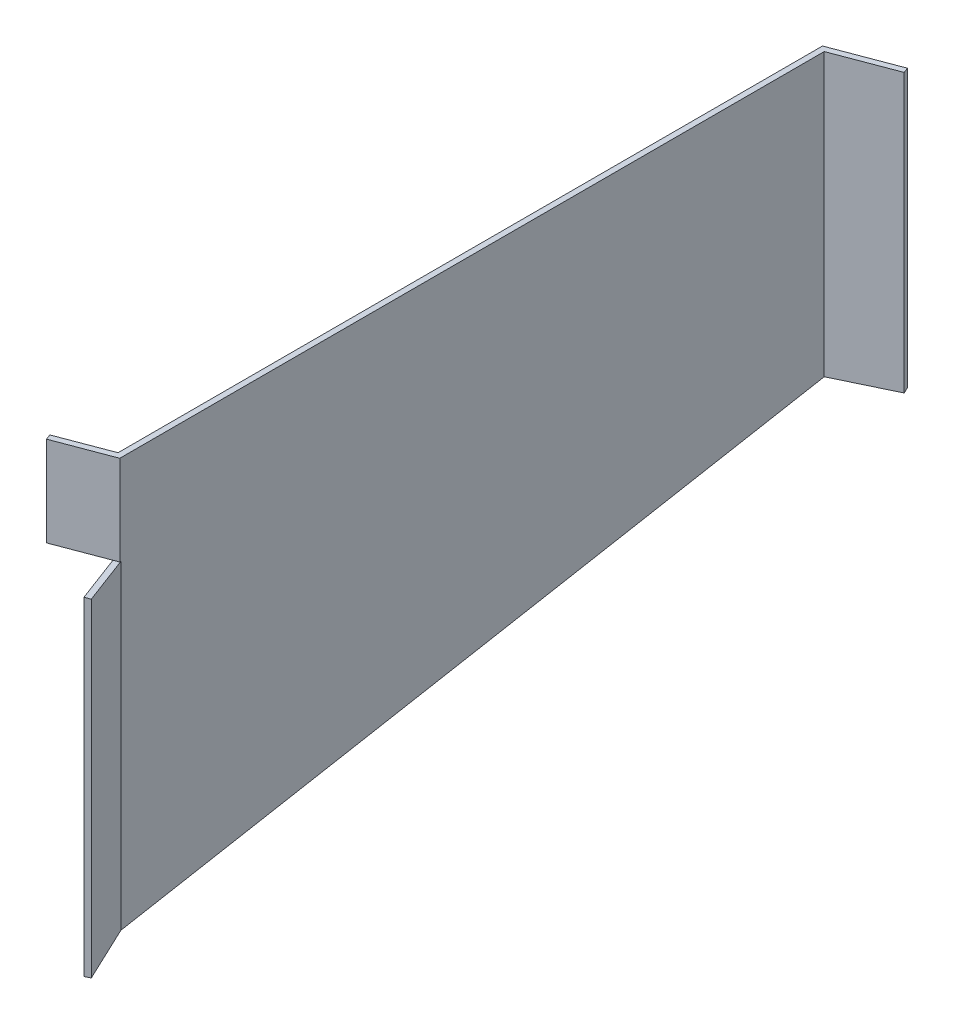
ISO-10303-21;
HEADER;
FILE_DESCRIPTION(('STEP AP214'),'2;1');
FILE_NAME('part.step','',(''),(''),'','','');
FILE_SCHEMA(('AUTOMOTIVE_DESIGN { 1 0 10303 214 1 1 1 1 }'));
ENDSEC;
DATA;
#1=APPLICATION_CONTEXT('core data for automotive mechanical design processes');
#2=APPLICATION_PROTOCOL_DEFINITION('international standard','automotive_design',2000,#1);
#3=PRODUCT_CONTEXT('',#1,'mechanical');
#4=PRODUCT('Part','Part','',(#3));
#5=PRODUCT_RELATED_PRODUCT_CATEGORY('part','',(#4));
#6=PRODUCT_DEFINITION_FORMATION('','',#4);
#7=PRODUCT_DEFINITION_CONTEXT('part definition',#1,'design');
#8=PRODUCT_DEFINITION('design','',#6,#7);
#9=PRODUCT_DEFINITION_SHAPE('','',#8);
#10=(LENGTH_UNIT() NAMED_UNIT(*) SI_UNIT(.MILLI.,.METRE.));
#11=(NAMED_UNIT(*) PLANE_ANGLE_UNIT() SI_UNIT($,.RADIAN.));
#12=(NAMED_UNIT(*) SI_UNIT($,.STERADIAN.) SOLID_ANGLE_UNIT());
#13=UNCERTAINTY_MEASURE_WITH_UNIT(LENGTH_MEASURE(1.E-05),#10,'distance_accuracy_value','');
#14=(GEOMETRIC_REPRESENTATION_CONTEXT(3) GLOBAL_UNCERTAINTY_ASSIGNED_CONTEXT((#13)) GLOBAL_UNIT_ASSIGNED_CONTEXT((#10,
#11,#12)) REPRESENTATION_CONTEXT('',''));
#15=CARTESIAN_POINT('',(0.,0.,0.));
#16=DIRECTION('',(0.,0.,1.));
#17=DIRECTION('',(1.,0.,0.));
#18=AXIS2_PLACEMENT_3D('',#15,#16,#17);
#19=CARTESIAN_POINT('',(0.,178.435,0.));
#20=DIRECTION('',(0.,-1.,0.));
#21=DIRECTION('',(0.,0.,-1.));
#22=AXIS2_PLACEMENT_3D('',#19,#20,#21);
#23=PLANE('',#22);
#24=DIRECTION('',(0.,0.,-1.));
#25=VECTOR('',#24,1.);
#26=CARTESIAN_POINT('',(0.,178.435,0.));
#27=LINE('',#26,#25);
#28=CARTESIAN_POINT('',(0.,178.435,0.));
#29=VERTEX_POINT('',#28);
#30=CARTESIAN_POINT('',(0.,178.435,-2.19557966754474));
#31=VERTEX_POINT('',#30);
#32=EDGE_CURVE('E214',#29,#31,#27,.T.);
#33=ORIENTED_EDGE('',*,*,#32,.F.);
#34=DIRECTION('',(-0.352995507839959,0.,-0.935625016470172));
#35=VECTOR('',#34,1.);
#36=CARTESIAN_POINT('',(0.,178.435,0.));
#37=LINE('',#36,#35);
#38=CARTESIAN_POINT('',(0.39562350566273,178.435,1.04861178338139));
#39=VERTEX_POINT('',#38);
#40=EDGE_CURVE('E164',#39,#29,#37,.T.);
#41=ORIENTED_EDGE('',*,*,#40,.F.);
#42=DIRECTION('',(0.935625016470171,0.,-0.35299550783996));
#43=VECTOR('',#42,1.);
#44=CARTESIAN_POINT('',(3.175,178.435,0.));
#45=LINE('',#44,#43);
#46=CARTESIAN_POINT('',(-26.5310942729279,178.435,11.2076073739187));
#47=VERTEX_POINT('',#46);
#48=EDGE_CURVE('E191',#47,#39,#45,.T.);
#49=ORIENTED_EDGE('',*,*,#48,.F.);
#50=DIRECTION('',(0.352995507839962,0.,0.935625016470171));
#51=VECTOR('',#50,1.);
#52=CARTESIAN_POINT('',(-26.5310942729279,178.435,11.2076073739187));
#53=LINE('',#52,#51);
#54=CARTESIAN_POINT('',(-27.6518550103198,178.435,8.23699794662595));
#55=VERTEX_POINT('',#54);
#56=EDGE_CURVE('E185',#55,#47,#53,.T.);
#57=ORIENTED_EDGE('',*,*,#56,.F.);
#58=DIRECTION('',(-0.935625016470171,0.,0.35299550783996));
#59=VECTOR('',#58,1.);
#60=CARTESIAN_POINT('',(-27.6518550103198,178.435,8.23699794662595));
#61=LINE('',#60,#59);
#62=EDGE_CURVE('E182',#31,#55,#61,.T.);
#63=ORIENTED_EDGE('',*,*,#62,.F.);
#64=EDGE_LOOP('',(#33,#41,#49,#57,#63));
#65=FACE_BOUND('',#64,.T.);
#66=ADVANCED_FACE('F45',(#65),#23,.T.);
#67=CARTESIAN_POINT('',(0.,228.6,0.));
#68=DIRECTION('',(1.,0.,0.));
#69=DIRECTION('',(0.,0.,-1.));
#70=AXIS2_PLACEMENT_3D('',#67,#68,#69);
#71=PLANE('',#70);
#72=ORIENTED_EDGE('',*,*,#32,.T.);
#73=DIRECTION('',(0.,1.,0.));
#74=VECTOR('',#73,1.);
#75=CARTESIAN_POINT('',(0.,228.6,-2.19557966754475));
#76=LINE('',#75,#74);
#77=CARTESIAN_POINT('',(0.,228.6,-2.19557966754472));
#78=VERTEX_POINT('',#77);
#79=EDGE_CURVE('E207',#31,#78,#76,.T.);
#80=ORIENTED_EDGE('',*,*,#79,.T.);
#81=DIRECTION('',(0.,0.,1.));
#82=VECTOR('',#81,1.);
#83=CARTESIAN_POINT('',(0.,228.6,0.));
#84=LINE('',#83,#82);
#85=CARTESIAN_POINT('',(0.,228.6,-395.409928));
#86=VERTEX_POINT('',#85);
#87=EDGE_CURVE('E255',#86,#78,#84,.T.);
#88=ORIENTED_EDGE('',*,*,#87,.F.);
#89=DIRECTION('',(0.,-1.,0.));
#90=VECTOR('',#89,1.);
#91=CARTESIAN_POINT('',(0.,228.6,-395.409928));
#92=LINE('',#91,#90);
#93=CARTESIAN_POINT('',(0.,71.795894,-395.409928));
#94=VERTEX_POINT('',#93);
#95=EDGE_CURVE('E264',#86,#94,#92,.T.);
#96=ORIENTED_EDGE('',*,*,#95,.T.);
#97=DIRECTION('',(0.,-0.178652221619614,0.983912284561168));
#98=VECTOR('',#97,1.);
#99=CARTESIAN_POINT('',(0.,0.,0.));
#100=LINE('',#99,#98);
#101=CARTESIAN_POINT('',(0.,0.,0.));
#102=VERTEX_POINT('',#101);
#103=EDGE_CURVE('E251',#94,#102,#100,.T.);
#104=ORIENTED_EDGE('',*,*,#103,.T.);
#105=DIRECTION('',(0.,-1.,0.));
#106=VECTOR('',#105,1.);
#107=CARTESIAN_POINT('',(0.,228.6,0.));
#108=LINE('',#107,#106);
#109=EDGE_CURVE('E11',#29,#102,#108,.T.);
#110=ORIENTED_EDGE('',*,*,#109,.F.);
#111=EDGE_LOOP('',(#72,#80,#88,#96,#104,#110));
#112=FACE_BOUND('',#111,.T.);
#113=ADVANCED_FACE('F47',(#112),#71,.F.);
#114=CARTESIAN_POINT('',(3.175,228.6,0.));
#115=DIRECTION('',(-1.,0.,0.));
#116=DIRECTION('',(0.,0.,1.));
#117=AXIS2_PLACEMENT_3D('',#114,#115,#116);
#118=PLANE('',#117);
#119=DIRECTION('',(0.,-1.,0.));
#120=VECTOR('',#119,1.);
#121=CARTESIAN_POINT('',(3.175,228.6,0.));
#122=LINE('',#121,#120);
#123=CARTESIAN_POINT('',(3.175,228.6,0.));
#124=VERTEX_POINT('',#123);
#125=CARTESIAN_POINT('',(3.175,178.435,0.));
#126=VERTEX_POINT('',#125);
#127=EDGE_CURVE('E54',#124,#126,#122,.T.);
#128=ORIENTED_EDGE('',*,*,#127,.T.);
#129=DIRECTION('',(0.,0.,-1.));
#130=VECTOR('',#129,1.);
#131=CARTESIAN_POINT('',(3.175,178.435,0.));
#132=LINE('',#131,#130);
#133=CARTESIAN_POINT('',(3.175,178.435,-0.579017489366659));
#134=VERTEX_POINT('',#133);
#135=EDGE_CURVE('E61',#126,#134,#132,.T.);
#136=ORIENTED_EDGE('',*,*,#135,.T.);
#137=DIRECTION('',(0.,1.,0.));
#138=VECTOR('',#137,1.);
#139=CARTESIAN_POINT('',(3.175,228.6,-0.579017489366659));
#140=LINE('',#139,#138);
#141=CARTESIAN_POINT('',(3.175,0.105134128778664,-0.579017489366656));
#142=VERTEX_POINT('',#141);
#143=EDGE_CURVE('E145',#142,#134,#140,.T.);
#144=ORIENTED_EDGE('',*,*,#143,.F.);
#145=DIRECTION('',(0.,-0.178652221619614,0.983912284561168));
#146=VECTOR('',#145,1.);
#147=CARTESIAN_POINT('',(3.175,0.,0.));
#148=LINE('',#147,#146);
#149=CARTESIAN_POINT('',(3.17500000000003,71.3972353070408,-393.214348332455));
#150=VERTEX_POINT('',#149);
#151=EDGE_CURVE('E250',#150,#142,#148,.T.);
#152=ORIENTED_EDGE('',*,*,#151,.F.);
#153=DIRECTION('',(0.,1.,0.));
#154=VECTOR('',#153,1.);
#155=CARTESIAN_POINT('',(3.17499999999993,228.6,-393.214348332455));
#156=LINE('',#155,#154);
#157=CARTESIAN_POINT('',(3.17500000000003,228.6,-393.214348332455));
#158=VERTEX_POINT('',#157);
#159=EDGE_CURVE('E246',#150,#158,#156,.T.);
#160=ORIENTED_EDGE('',*,*,#159,.T.);
#161=DIRECTION('',(0.,0.,-1.));
#162=VECTOR('',#161,1.);
#163=CARTESIAN_POINT('',(3.175,228.6,0.));
#164=LINE('',#163,#162);
#165=EDGE_CURVE('E69',#124,#158,#164,.T.);
#166=ORIENTED_EDGE('',*,*,#165,.F.);
#167=EDGE_LOOP('',(#128,#136,#144,#152,#160,#166));
#168=FACE_BOUND('',#167,.T.);
#169=ADVANCED_FACE('F270',(#168),#118,.F.);
#170=CARTESIAN_POINT('',(0.,228.6,0.));
#171=DIRECTION('',(0.,-1.,0.));
#172=DIRECTION('',(0.,0.,-1.));
#173=AXIS2_PLACEMENT_3D('',#170,#171,#172);
#174=PLANE('',#173);
#175=ORIENTED_EDGE('',*,*,#87,.T.);
#176=DIRECTION('',(-0.935625016470171,0.,0.35299550783996));
#177=VECTOR('',#176,1.);
#178=CARTESIAN_POINT('',(-27.6518550103198,228.6,8.23699794662595));
#179=LINE('',#178,#177);
#180=CARTESIAN_POINT('',(-27.6518550103198,228.6,8.23699794662595));
#181=VERTEX_POINT('',#180);
#182=EDGE_CURVE('E181',#78,#181,#179,.T.);
#183=ORIENTED_EDGE('',*,*,#182,.T.);
#184=DIRECTION('',(0.352995507839962,0.,0.935625016470171));
#185=VECTOR('',#184,1.);
#186=CARTESIAN_POINT('',(-26.5310942729279,228.6,11.2076073739187));
#187=LINE('',#186,#185);
#188=CARTESIAN_POINT('',(-26.5310942729279,228.6,11.2076073739187));
#189=VERTEX_POINT('',#188);
#190=EDGE_CURVE('E198',#181,#189,#187,.T.);
#191=ORIENTED_EDGE('',*,*,#190,.T.);
#192=DIRECTION('',(0.935625016470171,0.,-0.35299550783996));
#193=VECTOR('',#192,1.);
#194=CARTESIAN_POINT('',(3.175,228.6,0.));
#195=LINE('',#194,#193);
#196=EDGE_CURVE('E186',#189,#124,#195,.T.);
#197=ORIENTED_EDGE('',*,*,#196,.T.);
#198=ORIENTED_EDGE('',*,*,#165,.T.);
#199=DIRECTION('',(0.935625016470172,0.,-0.352995507839958));
#200=VECTOR('',#199,1.);
#201=CARTESIAN_POINT('',(35.5798300939882,228.6,-405.440143126453));
#202=LINE('',#201,#200);
#203=CARTESIAN_POINT('',(35.5798300939882,228.6,-405.440143126453));
#204=VERTEX_POINT('',#203);
#205=EDGE_CURVE('E218',#158,#204,#202,.T.);
#206=ORIENTED_EDGE('',*,*,#205,.T.);
#207=DIRECTION('',(-0.352995507839963,0.,-0.93562501647017));
#208=VECTOR('',#207,1.);
#209=CARTESIAN_POINT('',(34.4590693565963,228.6,-408.410752553746));
#210=LINE('',#209,#208);
#211=CARTESIAN_POINT('',(34.4590693565963,228.6,-408.410752553746));
#212=VERTEX_POINT('',#211);
#213=EDGE_CURVE('E229',#204,#212,#210,.T.);
#214=ORIENTED_EDGE('',*,*,#213,.T.);
#215=DIRECTION('',(-0.935625016470171,0.,0.352995507839962));
#216=VECTOR('',#215,1.);
#217=CARTESIAN_POINT('',(0.,228.6,-395.409928));
#218=LINE('',#217,#216);
#219=EDGE_CURVE('E233',#212,#86,#218,.T.);
#220=ORIENTED_EDGE('',*,*,#219,.T.);
#221=EDGE_LOOP('',(#175,#183,#191,#197,#198,#206,#214,#220));
#222=FACE_BOUND('',#221,.T.);
#223=ADVANCED_FACE('F274',(#222),#174,.F.);
#224=CARTESIAN_POINT('',(0.,0.,0.));
#225=DIRECTION('',(0.,0.983912284561168,0.178652221619614));
#226=DIRECTION('',(0.,-0.178652221619614,0.983912284561168));
#227=AXIS2_PLACEMENT_3D('',#224,#225,#226);
#228=PLANE('',#227);
#229=ORIENTED_EDGE('',*,*,#151,.T.);
#230=DIRECTION('',(-0.348009321879591,0.167484862933356,-0.922408983354511));
#231=VECTOR('',#230,1.);
#232=CARTESIAN_POINT('',(14.9810162356763,-5.57669358877128,30.7131771409394));
#233=LINE('',#232,#231);
#234=CARTESIAN_POINT('',(13.1625862171558,-4.70154604743276,25.8933746838513));
#235=VERTEX_POINT('',#234);
#236=EDGE_CURVE('E178',#235,#142,#233,.T.);
#237=ORIENTED_EDGE('',*,*,#236,.F.);
#238=DIRECTION('',(0.933709090703394,0.0639633172254529,-0.352272661424865));
#239=VECTOR('',#238,1.);
#240=CARTESIAN_POINT('',(8.34087364587423,-5.03185527740341,27.7125253561785));
#241=LINE('',#240,#239);
#242=CARTESIAN_POINT('',(10.191976789863,-4.90504629718154,27.0141354212432));
#243=VERTEX_POINT('',#242);
#244=EDGE_CURVE('E155',#243,#235,#241,.T.);
#245=ORIENTED_EDGE('',*,*,#244,.F.);
#246=DIRECTION('',(0.348009321879591,-0.167484862933356,0.922408983354511));
#247=VECTOR('',#246,1.);
#248=CARTESIAN_POINT('',(2.09246571169536,-1.00703145255776,5.5461421533326));
#249=LINE('',#248,#247);
#250=EDGE_CURVE('E157',#102,#243,#249,.T.);
#251=ORIENTED_EDGE('',*,*,#250,.F.);
#252=ORIENTED_EDGE('',*,*,#103,.F.);
#253=DIRECTION('',(0.933709090703393,0.0639633172254534,-0.352272661424868));
#254=VECTOR('',#253,1.);
#255=CARTESIAN_POINT('',(-2.30670175553962,71.6378744437987,-394.539648407964));
#256=LINE('',#255,#254);
#257=CARTESIAN_POINT('',(34.4590693565963,74.1564968970859,-408.410752553746));
#258=VERTEX_POINT('',#257);
#259=EDGE_CURVE('E222',#94,#258,#256,.T.);
#260=ORIENTED_EDGE('',*,*,#259,.T.);
#261=DIRECTION('',(0.348009321879595,-0.167484862933356,0.922408983354509));
#262=VECTOR('',#261,1.);
#263=CARTESIAN_POINT('',(36.8478665752881,73.0068513284348,-402.079174991304));
#264=LINE('',#263,#262);
#265=CARTESIAN_POINT('',(35.5798300939882,73.6171134763507,-405.440143126453));
#266=VERTEX_POINT('',#265);
#267=EDGE_CURVE('E219',#258,#266,#264,.T.);
#268=ORIENTED_EDGE('',*,*,#267,.T.);
#269=DIRECTION('',(-0.933709090703394,-0.0639633172254527,0.352272661424864));
#270=VECTOR('',#269,1.);
#271=CARTESIAN_POINT('',(33.164359409511,73.4516427540686,-404.528826855586));
#272=LINE('',#271,#270);
#273=EDGE_CURVE('E226',#266,#150,#272,.T.);
#274=ORIENTED_EDGE('',*,*,#273,.T.);
#275=EDGE_LOOP('',(#229,#237,#245,#251,#252,#260,#268,#274));
#276=FACE_BOUND('',#275,.T.);
#277=ADVANCED_FACE('F290',(#276),#228,.F.);
#278=CARTESIAN_POINT('',(35.5798300939882,33.1726382196239,-405.440143126453));
#279=DIRECTION('',(0.352995507839958,0.,0.935625016470172));
#280=DIRECTION('',(0.935625016470172,0.,-0.352995507839958));
#281=AXIS2_PLACEMENT_3D('',#278,#279,#280);
#282=PLANE('',#281);
#283=ORIENTED_EDGE('',*,*,#159,.F.);
#284=ORIENTED_EDGE('',*,*,#273,.F.);
#285=DIRECTION('',(0.,1.,0.));
#286=VECTOR('',#285,1.);
#287=CARTESIAN_POINT('',(35.5798300939882,33.1726382196239,-405.440143126453));
#288=LINE('',#287,#286);
#289=EDGE_CURVE('E237',#266,#204,#288,.T.);
#290=ORIENTED_EDGE('',*,*,#289,.T.);
#291=ORIENTED_EDGE('',*,*,#205,.F.);
#292=EDGE_LOOP('',(#283,#284,#290,#291));
#293=FACE_BOUND('',#292,.T.);
#294=ADVANCED_FACE('F299',(#293),#282,.T.);
#295=CARTESIAN_POINT('',(0.,33.1726382196239,-395.409928));
#296=DIRECTION('',(-0.352995507839962,0.,-0.935625016470171));
#297=DIRECTION('',(-0.935625016470171,0.,0.352995507839962));
#298=AXIS2_PLACEMENT_3D('',#295,#296,#297);
#299=PLANE('',#298);
#300=ORIENTED_EDGE('',*,*,#259,.F.);
#301=ORIENTED_EDGE('',*,*,#95,.F.);
#302=ORIENTED_EDGE('',*,*,#219,.F.);
#303=DIRECTION('',(0.,1.,0.));
#304=VECTOR('',#303,1.);
#305=CARTESIAN_POINT('',(34.4590693565963,33.1726382196239,-408.410752553746));
#306=LINE('',#305,#304);
#307=EDGE_CURVE('E223',#258,#212,#306,.T.);
#308=ORIENTED_EDGE('',*,*,#307,.F.);
#309=EDGE_LOOP('',(#300,#301,#302,#308));
#310=FACE_BOUND('',#309,.T.);
#311=ADVANCED_FACE('F306',(#310),#299,.T.);
#312=CARTESIAN_POINT('',(34.4590693565963,33.1726382196239,-408.410752553746));
#313=DIRECTION('',(0.93562501647017,0.,-0.352995507839963));
#314=DIRECTION('',(-0.352995507839963,0.,-0.93562501647017));
#315=AXIS2_PLACEMENT_3D('',#312,#313,#314);
#316=PLANE('',#315);
#317=ORIENTED_EDGE('',*,*,#267,.F.);
#318=ORIENTED_EDGE('',*,*,#307,.T.);
#319=ORIENTED_EDGE('',*,*,#213,.F.);
#320=ORIENTED_EDGE('',*,*,#289,.F.);
#321=EDGE_LOOP('',(#317,#318,#319,#320));
#322=FACE_BOUND('',#321,.T.);
#323=ADVANCED_FACE('F311',(#322),#316,.T.);
#324=CARTESIAN_POINT('',(-27.6518550103198,178.435,8.23699794662595));
#325=DIRECTION('',(-0.35299550783996,0.,-0.935625016470171));
#326=DIRECTION('',(-0.935625016470172,0.,0.35299550783996));
#327=AXIS2_PLACEMENT_3D('',#324,#325,#326);
#328=PLANE('',#327);
#329=ORIENTED_EDGE('',*,*,#79,.F.);
#330=ORIENTED_EDGE('',*,*,#62,.T.);
#331=DIRECTION('',(0.,1.,0.));
#332=VECTOR('',#331,1.);
#333=CARTESIAN_POINT('',(-27.6518550103198,178.435,8.23699794662595));
#334=LINE('',#333,#332);
#335=EDGE_CURVE('E195',#55,#181,#334,.T.);
#336=ORIENTED_EDGE('',*,*,#335,.T.);
#337=ORIENTED_EDGE('',*,*,#182,.F.);
#338=EDGE_LOOP('',(#329,#330,#336,#337));
#339=FACE_BOUND('',#338,.T.);
#340=ADVANCED_FACE('F309',(#339),#328,.T.);
#341=CARTESIAN_POINT('',(3.175,178.435,0.));
#342=DIRECTION('',(0.35299550783996,0.,0.935625016470171));
#343=DIRECTION('',(0.935625016470172,0.,-0.35299550783996));
#344=AXIS2_PLACEMENT_3D('',#341,#342,#343);
#345=PLANE('',#344);
#346=ORIENTED_EDGE('',*,*,#196,.F.);
#347=DIRECTION('',(0.,1.,0.));
#348=VECTOR('',#347,1.);
#349=CARTESIAN_POINT('',(-26.5310942729279,178.435,11.2076073739187));
#350=LINE('',#349,#348);
#351=EDGE_CURVE('E204',#47,#189,#350,.T.);
#352=ORIENTED_EDGE('',*,*,#351,.F.);
#353=ORIENTED_EDGE('',*,*,#48,.T.);
#354=EDGE_CURVE('E190',#39,#126,#45,.T.);
#355=ORIENTED_EDGE('',*,*,#354,.T.);
#356=ORIENTED_EDGE('',*,*,#127,.F.);
#357=EDGE_LOOP('',(#346,#352,#353,#355,#356));
#358=FACE_BOUND('',#357,.T.);
#359=ADVANCED_FACE('F273',(#358),#345,.T.);
#360=CARTESIAN_POINT('',(-26.5310942729279,178.435,11.2076073739187));
#361=DIRECTION('',(-0.935625016470171,0.,0.352995507839962));
#362=DIRECTION('',(0.352995507839962,0.,0.935625016470171));
#363=AXIS2_PLACEMENT_3D('',#360,#361,#362);
#364=PLANE('',#363);
#365=ORIENTED_EDGE('',*,*,#190,.F.);
#366=ORIENTED_EDGE('',*,*,#335,.F.);
#367=ORIENTED_EDGE('',*,*,#56,.T.);
#368=ORIENTED_EDGE('',*,*,#351,.T.);
#369=EDGE_LOOP('',(#365,#366,#367,#368));
#370=FACE_BOUND('',#369,.T.);
#371=ADVANCED_FACE('F278',(#370),#364,.T.);
#372=CARTESIAN_POINT('',(13.1625862171558,-35.8997902143087,25.8933746838513));
#373=DIRECTION('',(-0.935625016470172,0.,0.352995507839959));
#374=DIRECTION('',(0.352995507839959,0.,0.935625016470172));
#375=AXIS2_PLACEMENT_3D('',#372,#373,#374);
#376=PLANE('',#375);
#377=ORIENTED_EDGE('',*,*,#236,.T.);
#378=ORIENTED_EDGE('',*,*,#143,.T.);
#379=DIRECTION('',(0.352995507839958,0.,0.935625016470172));
#380=VECTOR('',#379,1.);
#381=CARTESIAN_POINT('',(13.1625862171558,178.435,25.8933746838513));
#382=LINE('',#381,#380);
#383=CARTESIAN_POINT('',(13.1625862171558,178.435,25.8933746838513));
#384=VERTEX_POINT('',#383);
#385=EDGE_CURVE('E139',#134,#384,#382,.T.);
#386=ORIENTED_EDGE('',*,*,#385,.T.);
#387=DIRECTION('',(0.,1.,0.));
#388=VECTOR('',#387,1.);
#389=CARTESIAN_POINT('',(13.1625862171558,-35.8997902143087,25.8933746838513));
#390=LINE('',#389,#388);
#391=EDGE_CURVE('E142',#235,#384,#390,.T.);
#392=ORIENTED_EDGE('',*,*,#391,.F.);
#393=EDGE_LOOP('',(#377,#378,#386,#392));
#394=FACE_BOUND('',#393,.T.);
#395=ADVANCED_FACE('F141',(#394),#376,.F.);
#396=CARTESIAN_POINT('',(0.,178.435,0.));
#397=DIRECTION('',(0.,1.,0.));
#398=DIRECTION('',(0.,0.,1.));
#399=AXIS2_PLACEMENT_3D('',#396,#397,#398);
#400=PLANE('',#399);
#401=ORIENTED_EDGE('',*,*,#135,.F.);
#402=ORIENTED_EDGE('',*,*,#354,.F.);
#403=CARTESIAN_POINT('',(10.191976789863,178.435,27.0141354212432));
#404=VERTEX_POINT('',#403);
#405=EDGE_CURVE('E162',#404,#39,#37,.T.);
#406=ORIENTED_EDGE('',*,*,#405,.F.);
#407=DIRECTION('',(-0.935625016470172,0.,0.352995507839959));
#408=VECTOR('',#407,1.);
#409=CARTESIAN_POINT('',(10.191976789863,178.435,27.0141354212432));
#410=LINE('',#409,#408);
#411=EDGE_CURVE('E148',#384,#404,#410,.T.);
#412=ORIENTED_EDGE('',*,*,#411,.F.);
#413=ORIENTED_EDGE('',*,*,#385,.F.);
#414=EDGE_LOOP('',(#401,#402,#406,#412,#413));
#415=FACE_BOUND('',#414,.T.);
#416=ADVANCED_FACE('F160',(#415),#400,.T.);
#417=CARTESIAN_POINT('',(0.,-35.8997902143087,0.));
#418=DIRECTION('',(0.935625016470172,0.,-0.352995507839959));
#419=DIRECTION('',(-0.352995507839959,0.,-0.935625016470172));
#420=AXIS2_PLACEMENT_3D('',#417,#418,#419);
#421=PLANE('',#420);
#422=ORIENTED_EDGE('',*,*,#109,.T.);
#423=ORIENTED_EDGE('',*,*,#250,.T.);
#424=DIRECTION('',(0.,1.,0.));
#425=VECTOR('',#424,1.);
#426=CARTESIAN_POINT('',(10.191976789863,-35.8997902143087,27.0141354212432));
#427=LINE('',#426,#425);
#428=EDGE_CURVE('E158',#243,#404,#427,.T.);
#429=ORIENTED_EDGE('',*,*,#428,.T.);
#430=ORIENTED_EDGE('',*,*,#405,.T.);
#431=ORIENTED_EDGE('',*,*,#40,.T.);
#432=EDGE_LOOP('',(#422,#423,#429,#430,#431));
#433=FACE_BOUND('',#432,.T.);
#434=ADVANCED_FACE('F287',(#433),#421,.F.);
#435=CARTESIAN_POINT('',(10.191976789863,-35.8997902143087,27.0141354212432));
#436=DIRECTION('',(-0.352995507839959,0.,-0.935625016470172));
#437=DIRECTION('',(-0.935625016470172,0.,0.352995507839959));
#438=AXIS2_PLACEMENT_3D('',#435,#436,#437);
#439=PLANE('',#438);
#440=ORIENTED_EDGE('',*,*,#428,.F.);
#441=ORIENTED_EDGE('',*,*,#244,.T.);
#442=ORIENTED_EDGE('',*,*,#391,.T.);
#443=ORIENTED_EDGE('',*,*,#411,.T.);
#444=EDGE_LOOP('',(#440,#441,#442,#443));
#445=FACE_BOUND('',#444,.T.);
#446=ADVANCED_FACE('F153',(#445),#439,.F.);
#447=CLOSED_SHELL('',(#66,#113,#169,#223,#277,#294,#311,#323,#340,#359,#371,#395,#416,#434,#446));
#448=MANIFOLD_SOLID_BREP('B2',#447);
#449=ADVANCED_BREP_SHAPE_REPRESENTATION('',(#18,#448),#14);
#450=SHAPE_DEFINITION_REPRESENTATION(#9,#449);
ENDSEC;
END-ISO-10303-21;
